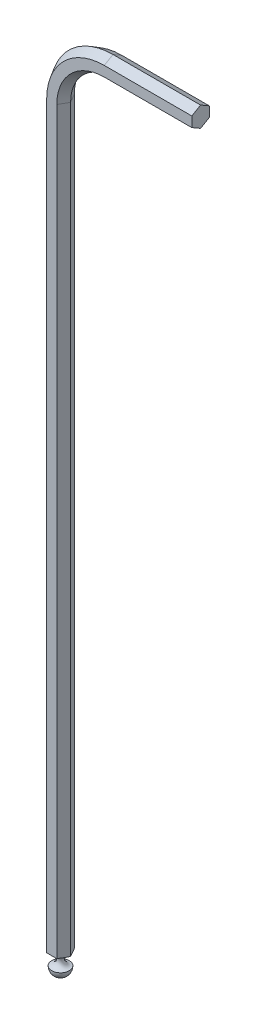
ISO-10303-21;
HEADER;
FILE_DESCRIPTION(('STEP AP214'),'2;1');
FILE_NAME('part.step','',(''),(''),'','','');
FILE_SCHEMA(('AUTOMOTIVE_DESIGN { 1 0 10303 214 1 1 1 1 }'));
ENDSEC;
DATA;
#1=APPLICATION_CONTEXT('core data for automotive mechanical design processes');
#2=APPLICATION_PROTOCOL_DEFINITION('international standard','automotive_design',2000,#1);
#3=PRODUCT_CONTEXT('',#1,'mechanical');
#4=PRODUCT('Part','Part','',(#3));
#5=PRODUCT_RELATED_PRODUCT_CATEGORY('part','',(#4));
#6=PRODUCT_DEFINITION_FORMATION('','',#4);
#7=PRODUCT_DEFINITION_CONTEXT('part definition',#1,'design');
#8=PRODUCT_DEFINITION('design','',#6,#7);
#9=PRODUCT_DEFINITION_SHAPE('','',#8);
#10=(LENGTH_UNIT() NAMED_UNIT(*) SI_UNIT(.MILLI.,.METRE.));
#11=(NAMED_UNIT(*) PLANE_ANGLE_UNIT() SI_UNIT($,.RADIAN.));
#12=(NAMED_UNIT(*) SI_UNIT($,.STERADIAN.) SOLID_ANGLE_UNIT());
#13=UNCERTAINTY_MEASURE_WITH_UNIT(LENGTH_MEASURE(1.E-05),#10,'distance_accuracy_value','');
#14=(GEOMETRIC_REPRESENTATION_CONTEXT(3) GLOBAL_UNCERTAINTY_ASSIGNED_CONTEXT((#13)) GLOBAL_UNIT_ASSIGNED_CONTEXT((#10,
#11,#12)) REPRESENTATION_CONTEXT('',''));
#15=CARTESIAN_POINT('',(0.,0.,0.));
#16=DIRECTION('',(0.,0.,1.));
#17=DIRECTION('',(1.,0.,0.));
#18=AXIS2_PLACEMENT_3D('',#15,#16,#17);
#19=CARTESIAN_POINT('',(0.577350269189627,86.,-1.));
#20=DIRECTION('',(0.,0.,1.));
#21=DIRECTION('',(1.,0.,0.));
#22=AXIS2_PLACEMENT_3D('',#19,#20,#21);
#23=PLANE('',#22);
#24=CARTESIAN_POINT('',(-5.6501425923021,2.10326012487134,-1.));
#25=CARTESIAN_POINT('',(-5.42963114128372,2.07434772756108,-1.));
#26=CARTESIAN_POINT('',(-5.20911425754675,2.0454763315478,-1.));
#27=CARTESIAN_POINT('',(-4.76804068208131,1.98787828469368,-1.));
#28=CARTESIAN_POINT('',(-4.54748398855826,1.95915164760065,-1.));
#29=CARTESIAN_POINT('',(-4.10576192808159,1.90183588406363,-1.));
#30=CARTESIAN_POINT('',(-3.88459648824613,1.87324731920584,-1.));
#31=CARTESIAN_POINT('',(-3.44224189276585,1.81641321937815,-1.));
#32=CARTESIAN_POINT('',(-3.22105274113787,1.78816765328578,-1.));
#33=CARTESIAN_POINT('',(-2.77980215060481,1.7324199485475,-1.));
#34=CARTESIAN_POINT('',(-2.55974111610904,1.70491460380354,-1.));
#35=CARTESIAN_POINT('',(-2.11942391076118,1.6509740133693,-1.));
#36=CARTESIAN_POINT('',(-1.89916770289715,1.62453906391261,-1.));
#37=CARTESIAN_POINT('',(-1.5687417950118,1.58674562521114,-1.));
#38=CARTESIAN_POINT('',(-1.45867816310614,1.57446643678915,-1.));
#39=CARTESIAN_POINT('',(-1.23843506827306,1.55090216735677,-1.));
#40=CARTESIAN_POINT('',(-1.12825559780996,1.53961715566528,-1.));
#41=CARTESIAN_POINT('',(-0.907795001210067,1.51866926106218,-1.));
#42=CARTESIAN_POINT('',(-0.797513952653791,1.50900557594335,-1.));
#43=CARTESIAN_POINT('',(-0.57675323193778,1.49236283889275,-1.));
#44=CARTESIAN_POINT('',(-0.466273596754964,1.48538333058255,-1.));
#45=CARTESIAN_POINT('',(-0.311199960535442,1.47846265192497,-1.));
#46=CARTESIAN_POINT('',(-0.266682515957964,1.47680782838215,-1.));
#47=CARTESIAN_POINT('',(-0.177624836510176,1.47423466885993,-1.));
#48=CARTESIAN_POINT('',(-0.133084600921502,1.4733163577352,-1.));
#49=CARTESIAN_POINT('',(0.00053310571268248,1.47175404960719,-1.));
#50=CARTESIAN_POINT('',(0.0896276624079897,1.47230172572759,-1.));
#51=CARTESIAN_POINT('',(0.267735524076091,1.47646589097584,-1.));
#52=CARTESIAN_POINT('',(0.35674883227126,1.48008225258611,-1.));
#53=CARTESIAN_POINT('',(0.490176312523298,1.48731406718286,-1.));
#54=CARTESIAN_POINT('',(0.534643047995527,1.49002639881505,-1.));
#55=CARTESIAN_POINT('',(0.623542386685099,1.49596004091703,-1.));
#56=CARTESIAN_POINT('',(0.667974990120448,1.49918134810832,-1.));
#57=CARTESIAN_POINT('',(0.800998729559069,1.50945794070344,-1.));
#58=CARTESIAN_POINT('',(0.889541226910564,1.51713903496005,-1.));
#59=CARTESIAN_POINT('',(1.06652262236569,1.53362282423679,-1.));
#60=CARTESIAN_POINT('',(1.15496151607708,1.54242556518749,-1.));
#61=CARTESIAN_POINT('',(1.42018310796843,1.56993612275819,-1.));
#62=CARTESIAN_POINT('',(1.59685056218989,1.58974452104575,-1.));
#63=CARTESIAN_POINT('',(1.95006936691828,1.63073804367271,-1.));
#64=CARTESIAN_POINT('',(2.12662067299477,1.65192353959665,-1.));
#65=CARTESIAN_POINT('',(2.47961881412114,1.69504554769092,-1.));
#66=CARTESIAN_POINT('',(2.6560656557548,1.71698200589651,-1.));
#67=CARTESIAN_POINT('',(3.00906552968384,1.76131368394236,-1.));
#68=CARTESIAN_POINT('',(3.18561851116977,1.78370930566272,-1.));
#69=CARTESIAN_POINT('',(3.53869304633518,1.82877980567928,-1.));
#70=CARTESIAN_POINT('',(3.71521459917581,1.85145469054519,-1.));
#71=CARTESIAN_POINT('',(4.06811579003091,1.89697399167147,-1.));
#72=CARTESIAN_POINT('',(4.2444954440052,1.91981828441563,-1.));
#73=CARTESIAN_POINT('',(4.59723305519039,1.9656392518755,-1.));
#74=CARTESIAN_POINT('',(4.77359101283513,1.98861592325018,-1.));
#75=CARTESIAN_POINT('',(4.94994362639685,2.01163329586331,-1.));
#76=B_SPLINE_CURVE_WITH_KNOTS('',3,(#24,#25,#26,#27,#28,#29,#30,#31,#32,#33,#34,#35,#36,#37,#38,
#39,#40,#41,#42,#43,#44,#45,#46,#47,#48,#49,#50,#51,#52,#53,#54,#55,#56,#57,#58,#59,#60,#61,#62,
#63,#64,#65,#66,#67,#68,#69,#70,#71,#72,#73,#74,#75),.UNSPECIFIED.,.F.,.F.,(4,2,2,2,2,2,2,2,2,2,
2,2,2,2,2,2,2,2,2,2,2,2,2,2,2,4),(0.,0.667196492245497,1.3344551973926,2.00347164447146,
2.67242692687178,3.33774655687749,4.00324907392509,4.33548603580457,4.66774614458432,
4.99984136827734,5.3318801023333,5.46551915337813,5.59916271407426,5.86638954467743,
6.13360527135659,6.26725118393948,6.40089623569493,6.66750902600805,6.93413273741671,
7.46744084318834,8.00089345457455,8.5343078117684,9.06821085342938,9.60212647934411,
10.135685045759,10.6692302044325),.UNSPECIFIED.);
#77=CARTESIAN_POINT('',(-0.577350269189625,1.492877061801,-1.));
#78=VERTEX_POINT('',#77);
#79=CARTESIAN_POINT('',(0.577350269189627,1.492877061801,-1.));
#80=VERTEX_POINT('',#79);
#81=EDGE_CURVE('E56',#78,#80,#76,.T.);
#82=ORIENTED_EDGE('',*,*,#81,.F.);
#83=DIRECTION('',(0.,-1.,0.));
#84=VECTOR('',#83,1.);
#85=CARTESIAN_POINT('',(-0.577350269189625,86.,-1.));
#86=LINE('',#85,#84);
#87=CARTESIAN_POINT('',(-0.577350269189625,86.,-1.));
#88=VERTEX_POINT('',#87);
#89=EDGE_CURVE('E163',#88,#78,#86,.T.);
#90=ORIENTED_EDGE('',*,*,#89,.F.);
#91=CARTESIAN_POINT('',(6.,86.,-1.));
#92=DIRECTION('',(0.,0.,-1.));
#93=DIRECTION('',(-1.,0.,0.));
#94=AXIS2_PLACEMENT_3D('',#91,#92,#93);
#95=CIRCLE('',#94,6.57735026918963);
#96=CARTESIAN_POINT('',(6.00000000000001,92.5773502691896,-1.));
#97=VERTEX_POINT('',#96);
#98=EDGE_CURVE('E193',#88,#97,#95,.T.);
#99=ORIENTED_EDGE('',*,*,#98,.T.);
#100=DIRECTION('',(1.,0.,0.));
#101=VECTOR('',#100,1.);
#102=CARTESIAN_POINT('',(6.00000000000001,92.5773502691896,-1.));
#103=LINE('',#102,#101);
#104=CARTESIAN_POINT('',(16.,92.5773502691896,-1.));
#105=VERTEX_POINT('',#104);
#106=EDGE_CURVE('E50',#97,#105,#103,.T.);
#107=ORIENTED_EDGE('',*,*,#106,.T.);
#108=DIRECTION('',(0.,1.,0.));
#109=VECTOR('',#108,1.);
#110=CARTESIAN_POINT('',(16.,91.4226497308104,-1.));
#111=LINE('',#110,#109);
#112=CARTESIAN_POINT('',(16.,91.4226497308104,-1.));
#113=VERTEX_POINT('',#112);
#114=EDGE_CURVE('E196',#113,#105,#111,.T.);
#115=ORIENTED_EDGE('',*,*,#114,.F.);
#116=DIRECTION('',(1.,0.,0.));
#117=VECTOR('',#116,1.);
#118=CARTESIAN_POINT('',(6.00000000000001,91.4226497308104,-1.));
#119=LINE('',#118,#117);
#120=CARTESIAN_POINT('',(6.00000000000001,91.4226497308104,-1.));
#121=VERTEX_POINT('',#120);
#122=EDGE_CURVE('E211',#121,#113,#119,.T.);
#123=ORIENTED_EDGE('',*,*,#122,.F.);
#124=CARTESIAN_POINT('',(6.,86.,-1.));
#125=DIRECTION('',(0.,0.,-1.));
#126=DIRECTION('',(-1.,0.,0.));
#127=AXIS2_PLACEMENT_3D('',#124,#125,#126);
#128=CIRCLE('',#127,5.42264973081037);
#129=CARTESIAN_POINT('',(0.577350269189627,86.,-1.));
#130=VERTEX_POINT('',#129);
#131=EDGE_CURVE('E178',#130,#121,#128,.T.);
#132=ORIENTED_EDGE('',*,*,#131,.F.);
#133=DIRECTION('',(0.,-1.,0.));
#134=VECTOR('',#133,1.);
#135=CARTESIAN_POINT('',(0.577350269189627,86.,-1.));
#136=LINE('',#135,#134);
#137=EDGE_CURVE('E151',#130,#80,#136,.T.);
#138=ORIENTED_EDGE('',*,*,#137,.T.);
#139=EDGE_LOOP('',(#82,#90,#99,#107,#115,#123,#132,#138));
#140=FACE_BOUND('',#139,.T.);
#141=ADVANCED_FACE('F37',(#140),#23,.F.);
#142=CARTESIAN_POINT('',(-0.577350269189625,86.,-1.));
#143=DIRECTION('',(0.866025403784439,0.,0.5));
#144=DIRECTION('',(0.5,0.,-0.866025403784439));
#145=AXIS2_PLACEMENT_3D('',#142,#143,#144);
#146=PLANE('',#145);
#147=CARTESIAN_POINT('',(-1.15481600843309,1.49289244204197,0.000200000000000166));
#148=CARTESIAN_POINT('',(-1.13076965317553,1.48969028124911,-0.0414495090429477));
#149=CARTESIAN_POINT('',(-1.10671313872879,1.48678503885603,-0.0831166143177092));
#150=CARTESIAN_POINT('',(-1.05857906999918,1.48168675373816,-0.166487266932406));
#151=CARTESIAN_POINT('',(-1.03450151391115,1.47949377971701,-0.208190817398966));
#152=CARTESIAN_POINT('',(-0.962308168049489,1.4741664934417,-0.333233360399755));
#153=CARTESIAN_POINT('',(-0.914166785916963,1.47227453613454,-0.416616680199877));
#154=CARTESIAN_POINT('',(-0.817884021651913,1.47227453613454,-0.583383319800122));
#155=CARTESIAN_POINT('',(-0.769742639519387,1.4741664934417,-0.666766639600245));
#156=CARTESIAN_POINT('',(-0.697549293657726,1.47949377971701,-0.791809182601034));
#157=CARTESIAN_POINT('',(-0.673471737569695,1.48168675373816,-0.833512733067594));
#158=CARTESIAN_POINT('',(-0.625337668840085,1.48678503885603,-0.916883385682291));
#159=CARTESIAN_POINT('',(-0.601281154393349,1.48969028124911,-0.958550490957052));
#160=CARTESIAN_POINT('',(-0.577234799135787,1.49289244204197,-1.0002));
#161=B_SPLINE_CURVE_WITH_KNOTS('',3,(#147,#148,#149,#150,#151,#152,#153,#154,#155,#156,#157,
#158,#159,#160),.UNSPECIFIED.,.F.,.F.,(4,2,2,2,2,2,4),(0.,0.144596832441597,0.289207608195957,
0.578038863048187,0.866870117900416,1.01148089365478,1.15607772609637),.UNSPECIFIED.);
#162=CARTESIAN_POINT('',(-1.15470053837925,1.492877061801,0.));
#163=VERTEX_POINT('',#162);
#164=EDGE_CURVE('E264',#163,#78,#161,.T.);
#165=ORIENTED_EDGE('',*,*,#164,.F.);
#166=DIRECTION('',(0.,-1.,0.));
#167=VECTOR('',#166,1.);
#168=CARTESIAN_POINT('',(-1.15470053837925,86.,0.));
#169=LINE('',#168,#167);
#170=CARTESIAN_POINT('',(-1.15470053837925,86.,0.));
#171=VERTEX_POINT('',#170);
#172=EDGE_CURVE('E160',#171,#163,#169,.T.);
#173=ORIENTED_EDGE('',*,*,#172,.F.);
#174=DIRECTION('',(-0.5,0.,0.866025403784439));
#175=VECTOR('',#174,1.);
#176=CARTESIAN_POINT('',(-0.577350269189625,86.,-1.));
#177=LINE('',#176,#175);
#178=EDGE_CURVE('E327',#88,#171,#177,.T.);
#179=ORIENTED_EDGE('',*,*,#178,.F.);
#180=ORIENTED_EDGE('',*,*,#89,.T.);
#181=EDGE_LOOP('',(#165,#173,#179,#180));
#182=FACE_BOUND('',#181,.T.);
#183=ADVANCED_FACE('F274',(#182),#146,.F.);
#184=CARTESIAN_POINT('',(-1.15470053837925,86.,0.));
#185=DIRECTION('',(0.866025403784439,0.,-0.5));
#186=DIRECTION('',(-0.5,0.,-0.866025403784439));
#187=AXIS2_PLACEMENT_3D('',#184,#185,#186);
#188=PLANE('',#187);
#189=CARTESIAN_POINT('',(-0.577234799135787,1.49289244204197,1.0002));
#190=CARTESIAN_POINT('',(-0.601281154393349,1.48969028124911,0.958550490957053));
#191=CARTESIAN_POINT('',(-0.625337668840085,1.48678503885603,0.916883385682292));
#192=CARTESIAN_POINT('',(-0.673471737569694,1.48168675373816,0.833512733067595));
#193=CARTESIAN_POINT('',(-0.697549293657726,1.47949377971701,0.791809182601035));
#194=CARTESIAN_POINT('',(-0.769742639519387,1.4741664934417,0.666766639600246));
#195=CARTESIAN_POINT('',(-0.817884021651913,1.47227453613454,0.583383319800123));
#196=CARTESIAN_POINT('',(-0.914166785916964,1.47227453613454,0.416616680199878));
#197=CARTESIAN_POINT('',(-0.962308168049489,1.4741664934417,0.333233360399755));
#198=CARTESIAN_POINT('',(-1.03450151391115,1.47949377971701,0.208190817398966));
#199=CARTESIAN_POINT('',(-1.05857906999918,1.48168675373816,0.166487266932406));
#200=CARTESIAN_POINT('',(-1.10671313872879,1.48678503885603,0.0831166143177094));
#201=CARTESIAN_POINT('',(-1.13076965317553,1.48969028124911,0.0414495090429478));
#202=CARTESIAN_POINT('',(-1.15481600843309,1.49289244204197,-0.000200000000000002));
#203=B_SPLINE_CURVE_WITH_KNOTS('',3,(#189,#190,#191,#192,#193,#194,#195,#196,#197,#198,#199,
#200,#201,#202),.UNSPECIFIED.,.F.,.F.,(4,2,2,2,2,2,4),(0.,0.144596832441597,0.289207608195957,
0.578038863048187,0.866870117900417,1.01148089365478,1.15607772609637),.UNSPECIFIED.);
#204=CARTESIAN_POINT('',(-0.577350269189625,1.492877061801,1.));
#205=VERTEX_POINT('',#204);
#206=EDGE_CURVE('E258',#205,#163,#203,.T.);
#207=ORIENTED_EDGE('',*,*,#206,.F.);
#208=DIRECTION('',(0.,-1.,0.));
#209=VECTOR('',#208,1.);
#210=CARTESIAN_POINT('',(-0.577350269189625,86.,1.));
#211=LINE('',#210,#209);
#212=CARTESIAN_POINT('',(-0.577350269189625,86.,1.));
#213=VERTEX_POINT('',#212);
#214=EDGE_CURVE('E153',#213,#205,#211,.T.);
#215=ORIENTED_EDGE('',*,*,#214,.F.);
#216=DIRECTION('',(0.5,0.,0.866025403784438));
#217=VECTOR('',#216,1.);
#218=CARTESIAN_POINT('',(-1.15470053837925,86.,0.));
#219=LINE('',#218,#217);
#220=EDGE_CURVE('E316',#171,#213,#219,.T.);
#221=ORIENTED_EDGE('',*,*,#220,.F.);
#222=ORIENTED_EDGE('',*,*,#172,.T.);
#223=EDGE_LOOP('',(#207,#215,#221,#222));
#224=FACE_BOUND('',#223,.T.);
#225=ADVANCED_FACE('F277',(#224),#188,.F.);
#226=CARTESIAN_POINT('',(-0.577350269189625,86.,1.));
#227=DIRECTION('',(0.,0.,-1.));
#228=DIRECTION('',(-1.,0.,0.));
#229=AXIS2_PLACEMENT_3D('',#226,#227,#228);
#230=PLANE('',#229);
#231=CARTESIAN_POINT('',(4.94994362639685,2.01163329586331,1.));
#232=CARTESIAN_POINT('',(4.74473559394161,1.98485259103782,1.));
#233=CARTESIAN_POINT('',(4.53952083794256,1.9581229930506,1.));
#234=CARTESIAN_POINT('',(4.12903463079898,1.90485113498203,1.));
#235=CARTESIAN_POINT('',(3.9237631757987,1.87830890462808,1.));
#236=CARTESIAN_POINT('',(3.51207950401972,1.82536322604773,1.));
#237=CARTESIAN_POINT('',(3.3056670917581,1.7989612928597,1.));
#238=CARTESIAN_POINT('',(2.89281389625504,1.74663518817485,1.));
#239=CARTESIAN_POINT('',(2.68637312221907,1.72071094403044,1.));
#240=CARTESIAN_POINT('',(2.27212979791329,1.66953535264947,1.));
#241=CARTESIAN_POINT('',(2.06432661381638,1.64428906731736,1.));
#242=CARTESIAN_POINT('',(1.75241550155159,1.60772579914882,1.));
#243=CARTESIAN_POINT('',(1.64838484591083,1.59575292160556,1.));
#244=CARTESIAN_POINT('',(1.44024827832134,1.57248352725274,1.));
#245=CARTESIAN_POINT('',(1.33614236709636,1.56118700402372,1.));
#246=CARTESIAN_POINT('',(1.12812503292832,1.53967678214214,1.));
#247=CARTESIAN_POINT('',(1.02421393210078,1.52946001213439,1.));
#248=CARTESIAN_POINT('',(0.816230327651702,1.51070293795392,1.));
#249=CARTESIAN_POINT('',(0.7121578154642,1.50216272605276,1.));
#250=CARTESIAN_POINT('',(0.503907767997254,1.48775795208762,1.));
#251=CARTESIAN_POINT('',(0.399730398333265,1.48189111102149,1.));
#252=CARTESIAN_POINT('',(0.191235244952443,1.4740423466649,1.));
#253=CARTESIAN_POINT('',(0.0869174966408948,1.47205957999977,1.));
#254=CARTESIAN_POINT('',(-0.0455949920106591,1.47235824091778,1.));
#255=CARTESIAN_POINT('',(-0.0738015736924669,1.47258401648092,1.));
#256=CARTESIAN_POINT('',(-0.130213902118794,1.47334725136594,1.));
#257=CARTESIAN_POINT('',(-0.158419648405238,1.47388474605869,1.));
#258=CARTESIAN_POINT('',(-0.242999724920609,1.47595128971748,1.));
#259=CARTESIAN_POINT('',(-0.299363228828425,1.47793447567021,1.));
#260=CARTESIAN_POINT('',(-0.444482910737833,1.48441072649878,1.));
#261=CARTESIAN_POINT('',(-0.533203304999471,1.48969146586294,1.));
#262=CARTESIAN_POINT('',(-0.710511062872193,1.50215800875486,1.));
#263=CARTESIAN_POINT('',(-0.799098414972192,1.50934396853997,1.));
#264=CARTESIAN_POINT('',(-0.976255724541181,1.52500627865802,1.));
#265=CARTESIAN_POINT('',(-1.06482555404353,1.53348404955129,1.));
#266=CARTESIAN_POINT('',(-1.24187353752039,1.55130134112897,1.));
#267=CARTESIAN_POINT('',(-1.33035169518415,1.56064082565507,1.));
#268=CARTESIAN_POINT('',(-1.59602279498802,1.58955101978653,1.));
#269=CARTESIAN_POINT('',(-1.77312141485274,1.6099817746217,1.));
#270=CARTESIAN_POINT('',(-2.12718681178547,1.65195371688353,1.));
#271=CARTESIAN_POINT('',(-2.30415358687978,1.67349492060763,1.));
#272=CARTESIAN_POINT('',(-2.65802293751285,1.71720515741625,1.));
#273=CARTESIAN_POINT('',(-2.83492550730677,1.7393742370149,1.));
#274=CARTESIAN_POINT('',(-3.18868150448399,1.7840885147823,1.));
#275=CARTESIAN_POINT('',(-3.36553493223129,1.80663371008518,1.));
#276=CARTESIAN_POINT('',(-3.8937733497698,1.87433217357982,1.));
#277=CARTESIAN_POINT('',(-4.24511363809777,1.91983399162892,1.));
#278=CARTESIAN_POINT('',(-4.77205736981776,1.98841171044565,1.));
#279=CARTESIAN_POINT('',(-4.947682285728,2.01132355448419,1.));
#280=CARTESIAN_POINT('',(-5.29892036052797,2.05723319088548,1.));
#281=CARTESIAN_POINT('',(-5.47453351945073,2.08023098299551,1.));
#282=CARTESIAN_POINT('',(-5.6501425923021,2.10326012487134,1.));
#283=B_SPLINE_CURVE_WITH_KNOTS('',3,(#231,#232,#233,#234,#235,#236,#237,#238,#239,#240,#241,
#242,#243,#244,#245,#246,#247,#248,#249,#250,#251,#252,#253,#254,#255,#256,#257,#258,#259,#260,
#261,#262,#263,#264,#265,#266,#267,#268,#269,#270,#271,#272,#273,#274,#275,#276,#277,#278,#279,
#280,#281,#282),.UNSPECIFIED.,.F.,.F.,(4,2,2,2,2,2,2,2,2,2,2,2,2,2,2,2,2,2,2,2,2,2,2,2,2,4),(0.,
0.620844555894481,1.24178549457336,1.86606730267035,2.4902533721974,3.11824230136459,
3.43239304789566,3.74654081226218,4.05976946512128,4.37301535209723,4.6859937005164,
4.99890408234931,5.08352540370443,5.16815632894785,5.33733918893456,5.60393968078483,
5.87056204474059,6.13747974877693,6.40438625778321,6.93919656994355,7.4740147334528,
8.0088726213891,8.54372643575574,9.6065490512233,10.137888479054,10.6692263457025),.UNSPECIFIED.);
#284=CARTESIAN_POINT('',(0.577350269189626,1.492877061801,1.));
#285=VERTEX_POINT('',#284);
#286=EDGE_CURVE('E145',#285,#205,#283,.T.);
#287=ORIENTED_EDGE('',*,*,#286,.F.);
#288=DIRECTION('',(0.,-1.,0.));
#289=VECTOR('',#288,1.);
#290=CARTESIAN_POINT('',(0.577350269189626,86.,1.));
#291=LINE('',#290,#289);
#292=CARTESIAN_POINT('',(0.577350269189626,86.,1.));
#293=VERTEX_POINT('',#292);
#294=EDGE_CURVE('E144',#293,#285,#291,.T.);
#295=ORIENTED_EDGE('',*,*,#294,.F.);
#296=CARTESIAN_POINT('',(6.,86.,1.));
#297=DIRECTION('',(0.,0.,-1.));
#298=DIRECTION('',(-1.,0.,0.));
#299=AXIS2_PLACEMENT_3D('',#296,#297,#298);
#300=CIRCLE('',#299,5.42264973081037);
#301=CARTESIAN_POINT('',(6.00000000000001,91.4226497308104,1.));
#302=VERTEX_POINT('',#301);
#303=EDGE_CURVE('E184',#293,#302,#300,.T.);
#304=ORIENTED_EDGE('',*,*,#303,.T.);
#305=DIRECTION('',(1.,0.,0.));
#306=VECTOR('',#305,1.);
#307=CARTESIAN_POINT('',(6.00000000000001,91.4226497308104,1.));
#308=LINE('',#307,#306);
#309=CARTESIAN_POINT('',(16.,91.4226497308104,1.));
#310=VERTEX_POINT('',#309);
#311=EDGE_CURVE('E217',#302,#310,#308,.T.);
#312=ORIENTED_EDGE('',*,*,#311,.T.);
#313=DIRECTION('',(0.,-1.,0.));
#314=VECTOR('',#313,1.);
#315=CARTESIAN_POINT('',(16.,92.5773502691896,1.));
#316=LINE('',#315,#314);
#317=CARTESIAN_POINT('',(16.,92.5773502691896,1.));
#318=VERTEX_POINT('',#317);
#319=EDGE_CURVE('E204',#318,#310,#316,.T.);
#320=ORIENTED_EDGE('',*,*,#319,.F.);
#321=DIRECTION('',(1.,0.,0.));
#322=VECTOR('',#321,1.);
#323=CARTESIAN_POINT('',(6.00000000000001,92.5773502691896,1.));
#324=LINE('',#323,#322);
#325=CARTESIAN_POINT('',(6.00000000000001,92.5773502691896,1.));
#326=VERTEX_POINT('',#325);
#327=EDGE_CURVE('E220',#326,#318,#324,.T.);
#328=ORIENTED_EDGE('',*,*,#327,.F.);
#329=CARTESIAN_POINT('',(6.,86.,1.));
#330=DIRECTION('',(0.,0.,-1.));
#331=DIRECTION('',(-1.,0.,0.));
#332=AXIS2_PLACEMENT_3D('',#329,#330,#331);
#333=CIRCLE('',#332,6.57735026918962);
#334=EDGE_CURVE('E187',#213,#326,#333,.T.);
#335=ORIENTED_EDGE('',*,*,#334,.F.);
#336=ORIENTED_EDGE('',*,*,#214,.T.);
#337=EDGE_LOOP('',(#287,#295,#304,#312,#320,#328,#335,#336));
#338=FACE_BOUND('',#337,.T.);
#339=ADVANCED_FACE('F319',(#338),#230,.F.);
#340=CARTESIAN_POINT('',(0.577350269189626,86.,1.));
#341=DIRECTION('',(-0.866025403784439,0.,-0.5));
#342=DIRECTION('',(-0.5,0.,0.866025403784439));
#343=AXIS2_PLACEMENT_3D('',#340,#341,#342);
#344=PLANE('',#343);
#345=CARTESIAN_POINT('',(1.15481600843309,1.49289244204197,-0.000199999999999711));
#346=CARTESIAN_POINT('',(1.13076965317553,1.48969028124911,0.0414495090429481));
#347=CARTESIAN_POINT('',(1.10671313872879,1.48678503885603,0.0831166143177096));
#348=CARTESIAN_POINT('',(1.05857906999918,1.48168675373816,0.166487266932406));
#349=CARTESIAN_POINT('',(1.03450151391115,1.47949377971701,0.208190817398966));
#350=CARTESIAN_POINT('',(0.96230816804949,1.4741664934417,0.333233360399755));
#351=CARTESIAN_POINT('',(0.914166785916965,1.47227453613454,0.416616680199878));
#352=CARTESIAN_POINT('',(0.817884021651914,1.47227453613454,0.583383319800123));
#353=CARTESIAN_POINT('',(0.769742639519388,1.4741664934417,0.666766639600246));
#354=CARTESIAN_POINT('',(0.697549293657727,1.47949377971701,0.791809182601035));
#355=CARTESIAN_POINT('',(0.673471737569696,1.48168675373816,0.833512733067595));
#356=CARTESIAN_POINT('',(0.625337668840086,1.48678503885603,0.916883385682292));
#357=CARTESIAN_POINT('',(0.60128115439335,1.48969028124911,0.958550490957053));
#358=CARTESIAN_POINT('',(0.577234799135788,1.49289244204197,1.0002));
#359=B_SPLINE_CURVE_WITH_KNOTS('',3,(#345,#346,#347,#348,#349,#350,#351,#352,#353,#354,#355,
#356,#357,#358),.UNSPECIFIED.,.F.,.F.,(4,2,2,2,2,2,4),(0.,0.144596832441597,0.289207608195957,
0.578038863048187,0.866870117900417,1.01148089365478,1.15607772609637),.UNSPECIFIED.);
#360=CARTESIAN_POINT('',(1.15470053837925,1.492877061801,0.));
#361=VERTEX_POINT('',#360);
#362=EDGE_CURVE('E130',#361,#285,#359,.T.);
#363=ORIENTED_EDGE('',*,*,#362,.F.);
#364=DIRECTION('',(0.,-1.,0.));
#365=VECTOR('',#364,1.);
#366=CARTESIAN_POINT('',(1.15470053837925,86.,0.));
#367=LINE('',#366,#365);
#368=CARTESIAN_POINT('',(1.15470053837925,86.,0.));
#369=VERTEX_POINT('',#368);
#370=EDGE_CURVE('E141',#369,#361,#367,.T.);
#371=ORIENTED_EDGE('',*,*,#370,.F.);
#372=DIRECTION('',(0.5,0.,-0.866025403784439));
#373=VECTOR('',#372,1.);
#374=CARTESIAN_POINT('',(0.577350269189626,86.,1.));
#375=LINE('',#374,#373);
#376=EDGE_CURVE('E328',#293,#369,#375,.T.);
#377=ORIENTED_EDGE('',*,*,#376,.F.);
#378=ORIENTED_EDGE('',*,*,#294,.T.);
#379=EDGE_LOOP('',(#363,#371,#377,#378));
#380=FACE_BOUND('',#379,.T.);
#381=ADVANCED_FACE('F139',(#380),#344,.F.);
#382=CARTESIAN_POINT('',(1.15470053837925,86.,0.));
#383=DIRECTION('',(-0.866025403784439,0.,0.5));
#384=DIRECTION('',(0.5,0.,0.866025403784439));
#385=AXIS2_PLACEMENT_3D('',#382,#383,#384);
#386=PLANE('',#385);
#387=CARTESIAN_POINT('',(0.577234799135789,1.49289244204197,-1.0002));
#388=CARTESIAN_POINT('',(0.60128115439335,1.48969028124911,-0.958550490957052));
#389=CARTESIAN_POINT('',(0.625337668840086,1.48678503885603,-0.916883385682291));
#390=CARTESIAN_POINT('',(0.673471737569696,1.48168675373816,-0.833512733067594));
#391=CARTESIAN_POINT('',(0.697549293657728,1.47949377971701,-0.791809182601034));
#392=CARTESIAN_POINT('',(0.769742639519389,1.4741664934417,-0.666766639600245));
#393=CARTESIAN_POINT('',(0.817884021651914,1.47227453613454,-0.583383319800122));
#394=CARTESIAN_POINT('',(0.914166785916965,1.47227453613454,-0.416616680199877));
#395=CARTESIAN_POINT('',(0.96230816804949,1.4741664934417,-0.333233360399754));
#396=CARTESIAN_POINT('',(1.03450151391115,1.47949377971701,-0.208190817398965));
#397=CARTESIAN_POINT('',(1.05857906999918,1.48168675373816,-0.166487266932405));
#398=CARTESIAN_POINT('',(1.10671313872879,1.48678503885603,-0.0831166143177087));
#399=CARTESIAN_POINT('',(1.13076965317553,1.48969028124911,-0.0414495090429472));
#400=CARTESIAN_POINT('',(1.15481600843309,1.49289244204197,0.000200000000000653));
#401=B_SPLINE_CURVE_WITH_KNOTS('',3,(#387,#388,#389,#390,#391,#392,#393,#394,#395,#396,#397,
#398,#399,#400),.UNSPECIFIED.,.F.,.F.,(4,2,2,2,2,2,4),(0.,0.144596832441597,0.289207608195957,
0.578038863048187,0.866870117900417,1.01148089365478,1.15607772609637),.UNSPECIFIED.);
#402=EDGE_CURVE('E11',#80,#361,#401,.T.);
#403=ORIENTED_EDGE('',*,*,#402,.F.);
#404=ORIENTED_EDGE('',*,*,#137,.F.);
#405=DIRECTION('',(-0.5,0.,-0.866025403784439));
#406=VECTOR('',#405,1.);
#407=CARTESIAN_POINT('',(1.15470053837925,86.,0.));
#408=LINE('',#407,#406);
#409=EDGE_CURVE('E150',#369,#130,#408,.T.);
#410=ORIENTED_EDGE('',*,*,#409,.F.);
#411=ORIENTED_EDGE('',*,*,#370,.T.);
#412=EDGE_LOOP('',(#403,#404,#410,#411));
#413=FACE_BOUND('',#412,.T.);
#414=ADVANCED_FACE('F148',(#413),#386,.F.);
#415=CARTESIAN_POINT('',(6.00000000000001,92.5773502691896,-1.));
#416=DIRECTION('',(0.,0.866025403784438,-0.5));
#417=DIRECTION('',(0.,0.5,0.866025403784439));
#418=AXIS2_PLACEMENT_3D('',#415,#416,#417);
#419=PLANE('',#418);
#420=DIRECTION('',(0.,0.5,0.866025403784439));
#421=VECTOR('',#420,1.);
#422=CARTESIAN_POINT('',(6.00000000000001,92.5773502691896,-1.));
#423=LINE('',#422,#421);
#424=CARTESIAN_POINT('',(6.00000000000001,93.1547005383792,0.));
#425=VERTEX_POINT('',#424);
#426=EDGE_CURVE('E175',#97,#425,#423,.T.);
#427=ORIENTED_EDGE('',*,*,#426,.T.);
#428=DIRECTION('',(1.,0.,0.));
#429=VECTOR('',#428,1.);
#430=CARTESIAN_POINT('',(6.00000000000001,93.1547005383792,0.));
#431=LINE('',#430,#429);
#432=CARTESIAN_POINT('',(16.,93.1547005383792,0.));
#433=VERTEX_POINT('',#432);
#434=EDGE_CURVE('E223',#425,#433,#431,.T.);
#435=ORIENTED_EDGE('',*,*,#434,.T.);
#436=DIRECTION('',(0.,0.5,0.866025403784439));
#437=VECTOR('',#436,1.);
#438=CARTESIAN_POINT('',(16.,92.5773502691896,-1.));
#439=LINE('',#438,#437);
#440=EDGE_CURVE('E64',#105,#433,#439,.T.);
#441=ORIENTED_EDGE('',*,*,#440,.F.);
#442=ORIENTED_EDGE('',*,*,#106,.F.);
#443=EDGE_LOOP('',(#427,#435,#441,#442));
#444=FACE_BOUND('',#443,.T.);
#445=ADVANCED_FACE('F39',(#444),#419,.T.);
#446=CARTESIAN_POINT('',(6.00000000000001,93.1547005383792,0.));
#447=DIRECTION('',(0.,0.866025403784439,0.5));
#448=DIRECTION('',(0.,-0.5,0.866025403784439));
#449=AXIS2_PLACEMENT_3D('',#446,#447,#448);
#450=PLANE('',#449);
#451=DIRECTION('',(0.,-0.5,0.866025403784438));
#452=VECTOR('',#451,1.);
#453=CARTESIAN_POINT('',(6.00000000000001,93.1547005383792,0.));
#454=LINE('',#453,#452);
#455=EDGE_CURVE('E172',#425,#326,#454,.T.);
#456=ORIENTED_EDGE('',*,*,#455,.T.);
#457=ORIENTED_EDGE('',*,*,#327,.T.);
#458=DIRECTION('',(0.,-0.5,0.866025403784438));
#459=VECTOR('',#458,1.);
#460=CARTESIAN_POINT('',(16.,93.1547005383792,0.));
#461=LINE('',#460,#459);
#462=EDGE_CURVE('E207',#433,#318,#461,.T.);
#463=ORIENTED_EDGE('',*,*,#462,.F.);
#464=ORIENTED_EDGE('',*,*,#434,.F.);
#465=EDGE_LOOP('',(#456,#457,#463,#464));
#466=FACE_BOUND('',#465,.T.);
#467=ADVANCED_FACE('F306',(#466),#450,.T.);
#468=CARTESIAN_POINT('',(6.00000000000001,91.4226497308104,1.));
#469=DIRECTION('',(0.,-0.866025403784439,0.5));
#470=DIRECTION('',(0.,-0.5,-0.866025403784439));
#471=AXIS2_PLACEMENT_3D('',#468,#469,#470);
#472=PLANE('',#471);
#473=DIRECTION('',(0.,-0.5,-0.866025403784439));
#474=VECTOR('',#473,1.);
#475=CARTESIAN_POINT('',(6.00000000000001,91.4226497308104,1.));
#476=LINE('',#475,#474);
#477=CARTESIAN_POINT('',(6.00000000000001,90.8452994616207,0.));
#478=VERTEX_POINT('',#477);
#479=EDGE_CURVE('E169',#302,#478,#476,.T.);
#480=ORIENTED_EDGE('',*,*,#479,.T.);
#481=DIRECTION('',(1.,0.,0.));
#482=VECTOR('',#481,1.);
#483=CARTESIAN_POINT('',(6.00000000000001,90.8452994616207,0.));
#484=LINE('',#483,#482);
#485=CARTESIAN_POINT('',(16.,90.8452994616207,0.));
#486=VERTEX_POINT('',#485);
#487=EDGE_CURVE('E214',#478,#486,#484,.T.);
#488=ORIENTED_EDGE('',*,*,#487,.T.);
#489=DIRECTION('',(0.,-0.5,-0.866025403784439));
#490=VECTOR('',#489,1.);
#491=CARTESIAN_POINT('',(16.,91.4226497308104,1.));
#492=LINE('',#491,#490);
#493=EDGE_CURVE('E201',#310,#486,#492,.T.);
#494=ORIENTED_EDGE('',*,*,#493,.F.);
#495=ORIENTED_EDGE('',*,*,#311,.F.);
#496=EDGE_LOOP('',(#480,#488,#494,#495));
#497=FACE_BOUND('',#496,.T.);
#498=ADVANCED_FACE('F303',(#497),#472,.T.);
#499=CARTESIAN_POINT('',(6.00000000000001,90.8452994616207,0.));
#500=DIRECTION('',(0.,-0.866025403784439,-0.5));
#501=DIRECTION('',(0.,0.5,-0.866025403784439));
#502=AXIS2_PLACEMENT_3D('',#499,#500,#501);
#503=PLANE('',#502);
#504=DIRECTION('',(0.,0.5,-0.866025403784439));
#505=VECTOR('',#504,1.);
#506=CARTESIAN_POINT('',(6.00000000000001,90.8452994616207,0.));
#507=LINE('',#506,#505);
#508=EDGE_CURVE('E166',#478,#121,#507,.T.);
#509=ORIENTED_EDGE('',*,*,#508,.T.);
#510=ORIENTED_EDGE('',*,*,#122,.T.);
#511=DIRECTION('',(0.,0.5,-0.866025403784439));
#512=VECTOR('',#511,1.);
#513=CARTESIAN_POINT('',(16.,90.8452994616207,0.));
#514=LINE('',#513,#512);
#515=EDGE_CURVE('E198',#486,#113,#514,.T.);
#516=ORIENTED_EDGE('',*,*,#515,.F.);
#517=ORIENTED_EDGE('',*,*,#487,.F.);
#518=EDGE_LOOP('',(#509,#510,#516,#517));
#519=FACE_BOUND('',#518,.T.);
#520=ADVANCED_FACE('F299',(#519),#503,.T.);
#521=CARTESIAN_POINT('',(6.,86.,-1.));
#522=DIRECTION('',(0.,0.,1.));
#523=DIRECTION('',(1.,0.,0.));
#524=AXIS2_PLACEMENT_3D('',#521,#522,#523);
#525=CONICAL_SURFACE('',#524,6.57735026918963,0.523598775598298);
#526=ORIENTED_EDGE('',*,*,#178,.T.);
#527=CARTESIAN_POINT('',(6.,86.,0.));
#528=DIRECTION('',(0.,0.,-1.));
#529=DIRECTION('',(-1.,0.,0.));
#530=AXIS2_PLACEMENT_3D('',#527,#528,#529);
#531=CIRCLE('',#530,7.15470053837925);
#532=EDGE_CURVE('E190',#171,#425,#531,.T.);
#533=ORIENTED_EDGE('',*,*,#532,.T.);
#534=ORIENTED_EDGE('',*,*,#426,.F.);
#535=ORIENTED_EDGE('',*,*,#98,.F.);
#536=EDGE_LOOP('',(#526,#533,#534,#535));
#537=FACE_BOUND('',#536,.T.);
#538=ADVANCED_FACE('F295',(#537),#525,.T.);
#539=CARTESIAN_POINT('',(6.,86.,0.));
#540=DIRECTION('',(0.,0.,-1.));
#541=DIRECTION('',(-1.,0.,0.));
#542=AXIS2_PLACEMENT_3D('',#539,#540,#541);
#543=CONICAL_SURFACE('',#542,7.15470053837925,0.523598775598299);
#544=ORIENTED_EDGE('',*,*,#220,.T.);
#545=ORIENTED_EDGE('',*,*,#334,.T.);
#546=ORIENTED_EDGE('',*,*,#455,.F.);
#547=ORIENTED_EDGE('',*,*,#532,.F.);
#548=EDGE_LOOP('',(#544,#545,#546,#547));
#549=FACE_BOUND('',#548,.T.);
#550=ADVANCED_FACE('F291',(#549),#543,.T.);
#551=CARTESIAN_POINT('',(6.,86.,1.));
#552=DIRECTION('',(0.,0.,1.));
#553=DIRECTION('',(1.,0.,0.));
#554=AXIS2_PLACEMENT_3D('',#551,#552,#553);
#555=CONICAL_SURFACE('',#554,5.42264973081037,0.523598775598299);
#556=ORIENTED_EDGE('',*,*,#376,.T.);
#557=CARTESIAN_POINT('',(6.,86.,0.));
#558=DIRECTION('',(0.,0.,-1.));
#559=DIRECTION('',(-1.,0.,0.));
#560=AXIS2_PLACEMENT_3D('',#557,#558,#559);
#561=CIRCLE('',#560,4.84529946162075);
#562=EDGE_CURVE('E181',#369,#478,#561,.T.);
#563=ORIENTED_EDGE('',*,*,#562,.T.);
#564=ORIENTED_EDGE('',*,*,#479,.F.);
#565=ORIENTED_EDGE('',*,*,#303,.F.);
#566=EDGE_LOOP('',(#556,#563,#564,#565));
#567=FACE_BOUND('',#566,.T.);
#568=ADVANCED_FACE('F287',(#567),#555,.F.);
#569=CARTESIAN_POINT('',(6.,86.,0.));
#570=DIRECTION('',(0.,0.,-1.));
#571=DIRECTION('',(-1.,0.,0.));
#572=AXIS2_PLACEMENT_3D('',#569,#570,#571);
#573=CONICAL_SURFACE('',#572,4.84529946162075,0.523598775598299);
#574=ORIENTED_EDGE('',*,*,#409,.T.);
#575=ORIENTED_EDGE('',*,*,#131,.T.);
#576=ORIENTED_EDGE('',*,*,#508,.F.);
#577=ORIENTED_EDGE('',*,*,#562,.F.);
#578=EDGE_LOOP('',(#574,#575,#576,#577));
#579=FACE_BOUND('',#578,.T.);
#580=ADVANCED_FACE('F284',(#579),#573,.F.);
#581=CARTESIAN_POINT('',(16.,92.,0.));
#582=DIRECTION('',(1.,0.,0.));
#583=DIRECTION('',(0.,0.,1.));
#584=AXIS2_PLACEMENT_3D('',#581,#582,#583);
#585=PLANE('',#584);
#586=ORIENTED_EDGE('',*,*,#114,.T.);
#587=ORIENTED_EDGE('',*,*,#440,.T.);
#588=ORIENTED_EDGE('',*,*,#462,.T.);
#589=ORIENTED_EDGE('',*,*,#319,.T.);
#590=ORIENTED_EDGE('',*,*,#493,.T.);
#591=ORIENTED_EDGE('',*,*,#515,.T.);
#592=EDGE_LOOP('',(#586,#587,#588,#589,#590,#591));
#593=FACE_BOUND('',#592,.T.);
#594=ADVANCED_FACE('F249',(#593),#585,.T.);
#595=CARTESIAN_POINT('',(0.,1.46906423818137,0.));
#596=DIRECTION('',(0.,1.,0.));
#597=DIRECTION('',(0.,0.,1.));
#598=AXIS2_PLACEMENT_3D('',#595,#596,#597);
#599=CONICAL_SURFACE('',#598,0.975894468971785,1.43839857767982);
#600=CARTESIAN_POINT('',(0.,1.46906423818137,0.));
#601=DIRECTION('',(0.,-1.,0.));
#602=DIRECTION('',(0.,0.,-1.));
#603=AXIS2_PLACEMENT_3D('',#600,#601,#602);
#604=CIRCLE('',#603,0.975894468971785);
#605=CARTESIAN_POINT('',(0.,1.46906423818137,-0.975894468971785));
#606=VERTEX_POINT('',#605);
#607=EDGE_CURVE('E227',#606,#606,#604,.T.);
#608=ORIENTED_EDGE('',*,*,#607,.F.);
#609=EDGE_LOOP('',(#608));
#610=FACE_BOUND('',#609,.T.);
#611=ORIENTED_EDGE('',*,*,#81,.T.);
#612=ORIENTED_EDGE('',*,*,#402,.T.);
#613=ORIENTED_EDGE('',*,*,#362,.T.);
#614=ORIENTED_EDGE('',*,*,#286,.T.);
#615=ORIENTED_EDGE('',*,*,#206,.T.);
#616=ORIENTED_EDGE('',*,*,#164,.T.);
#617=EDGE_LOOP('',(#611,#612,#613,#614,#615,#616));
#618=FACE_BOUND('',#617,.T.);
#619=ADVANCED_FACE('F129',(#610,#618),#599,.T.);
#620=CARTESIAN_POINT('',(0.,0.735540560177301,0.));
#621=DIRECTION('',(0.,-1.,0.));
#622=DIRECTION('',(0.,0.,-1.));
#623=AXIS2_PLACEMENT_3D('',#620,#621,#622);
#624=TOROIDAL_SURFACE('',#623,1.07358281938973,0.74);
#625=ORIENTED_EDGE('',*,*,#607,.T.);
#626=EDGE_LOOP('',(#625));
#627=FACE_BOUND('',#626,.T.);
#628=CARTESIAN_POINT('',(0.,-0.000791920801183443,0.));
#629=DIRECTION('',(0.,-1.,0.));
#630=DIRECTION('',(0.,0.,-1.));
#631=AXIS2_PLACEMENT_3D('',#628,#629,#630);
#632=CIRCLE('',#631,0.999999686430674);
#633=CARTESIAN_POINT('',(0.,-0.000791920801183443,-0.999999686430674));
#634=VERTEX_POINT('',#633);
#635=EDGE_CURVE('E146',#634,#634,#632,.F.);
#636=ORIENTED_EDGE('',*,*,#635,.T.);
#637=EDGE_LOOP('',(#636));
#638=FACE_BOUND('',#637,.T.);
#639=ADVANCED_FACE('F248',(#627,#638),#624,.F.);
#640=CARTESIAN_POINT('',(0.,0.,0.));
#641=DIRECTION('',(0.,1.,0.));
#642=DIRECTION('',(0.,0.,-1.));
#643=AXIS2_PLACEMENT_3D('',#640,#641,#642);
#644=SPHERICAL_SURFACE('',#643,1.);
#645=ORIENTED_EDGE('',*,*,#635,.F.);
#646=EDGE_LOOP('',(#645));
#647=FACE_BOUND('',#646,.T.);
#648=ADVANCED_FACE('F352',(#647),#644,.T.);
#649=CLOSED_SHELL('',(#141,#183,#225,#339,#381,#414,#445,#467,#498,#520,#538,#550,#568,#580,
#594,#619,#639,#648));
#650=MANIFOLD_SOLID_BREP('B2',#649);
#651=ADVANCED_BREP_SHAPE_REPRESENTATION('',(#18,#650),#14);
#652=SHAPE_DEFINITION_REPRESENTATION(#9,#651);
ENDSEC;
END-ISO-10303-21;
